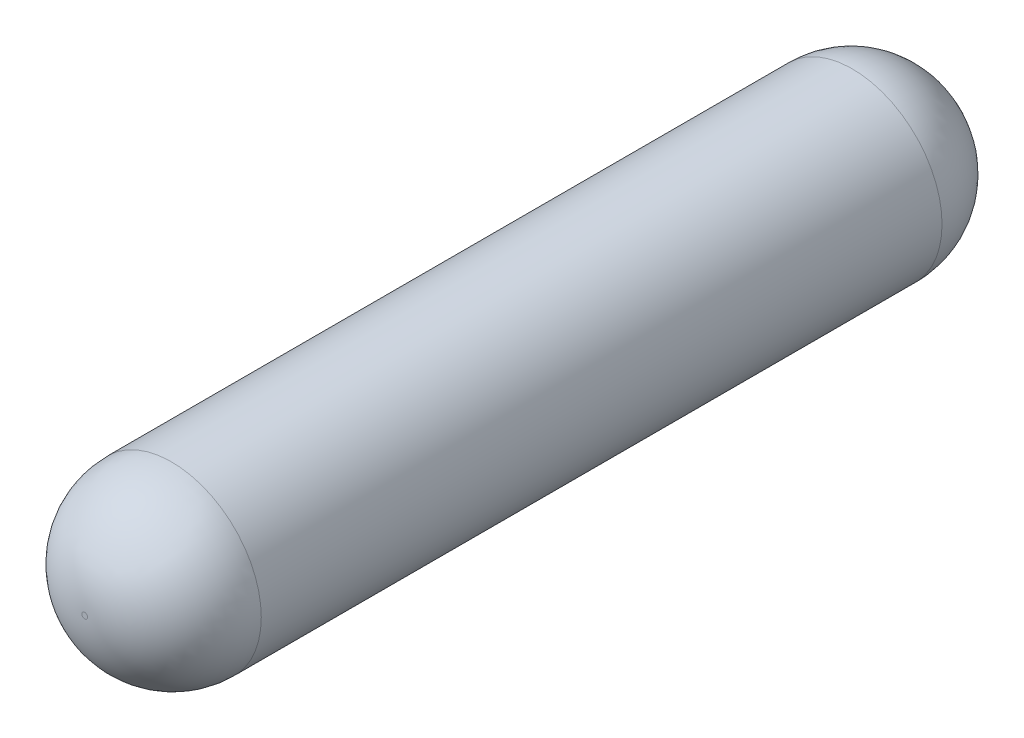
ISO-10303-21;
HEADER;
FILE_DESCRIPTION(('STEP AP214'),'2;1');
FILE_NAME('part.step','',(''),(''),'','','');
FILE_SCHEMA(('AUTOMOTIVE_DESIGN { 1 0 10303 214 1 1 1 1 }'));
ENDSEC;
DATA;
#1=APPLICATION_CONTEXT('core data for automotive mechanical design processes');
#2=APPLICATION_PROTOCOL_DEFINITION('international standard','automotive_design',2000,#1);
#3=PRODUCT_CONTEXT('',#1,'mechanical');
#4=PRODUCT('Part','Part','',(#3));
#5=PRODUCT_RELATED_PRODUCT_CATEGORY('part','',(#4));
#6=PRODUCT_DEFINITION_FORMATION('','',#4);
#7=PRODUCT_DEFINITION_CONTEXT('part definition',#1,'design');
#8=PRODUCT_DEFINITION('design','',#6,#7);
#9=PRODUCT_DEFINITION_SHAPE('','',#8);
#10=(LENGTH_UNIT() NAMED_UNIT(*) SI_UNIT(.MILLI.,.METRE.));
#11=(NAMED_UNIT(*) PLANE_ANGLE_UNIT() SI_UNIT($,.RADIAN.));
#12=(NAMED_UNIT(*) SI_UNIT($,.STERADIAN.) SOLID_ANGLE_UNIT());
#13=UNCERTAINTY_MEASURE_WITH_UNIT(LENGTH_MEASURE(1.E-05),#10,'distance_accuracy_value','');
#14=(GEOMETRIC_REPRESENTATION_CONTEXT(3) GLOBAL_UNCERTAINTY_ASSIGNED_CONTEXT((#13)) GLOBAL_UNIT_ASSIGNED_CONTEXT((#10,
#11,#12)) REPRESENTATION_CONTEXT('',''));
#15=CARTESIAN_POINT('',(0.,0.,0.));
#16=DIRECTION('',(0.,0.,1.));
#17=DIRECTION('',(1.,0.,0.));
#18=AXIS2_PLACEMENT_3D('',#15,#16,#17);
#19=CARTESIAN_POINT('',(0.,0.,60.));
#20=DIRECTION('',(0.,0.,-1.));
#21=DIRECTION('',(-1.,0.,0.));
#22=AXIS2_PLACEMENT_3D('',#19,#20,#21);
#23=CYLINDRICAL_SURFACE('',#22,6.3);
#24=CARTESIAN_POINT('',(0.,0.,6.1));
#25=DIRECTION('',(0.,0.,1.));
#26=DIRECTION('',(1.,0.,0.));
#27=AXIS2_PLACEMENT_3D('',#24,#25,#26);
#28=CIRCLE('',#27,6.3);
#29=CARTESIAN_POINT('',(6.3,0.,6.1));
#30=VERTEX_POINT('',#29);
#31=EDGE_CURVE('E50',#30,#30,#28,.T.);
#32=ORIENTED_EDGE('',*,*,#31,.T.);
#33=EDGE_LOOP('',(#32));
#34=FACE_BOUND('',#33,.T.);
#35=CARTESIAN_POINT('',(0.,0.,53.9));
#36=DIRECTION('',(0.,0.,1.));
#37=DIRECTION('',(1.,0.,0.));
#38=AXIS2_PLACEMENT_3D('',#35,#36,#37);
#39=CIRCLE('',#38,6.3);
#40=CARTESIAN_POINT('',(6.3,0.,53.9));
#41=VERTEX_POINT('',#40);
#42=EDGE_CURVE('E51',#41,#41,#39,.F.);
#43=ORIENTED_EDGE('',*,*,#42,.T.);
#44=EDGE_LOOP('',(#43));
#45=FACE_BOUND('',#44,.T.);
#46=ADVANCED_FACE('F38',(#34,#45),#23,.T.);
#47=CARTESIAN_POINT('',(0.,0.,60.));
#48=DIRECTION('',(0.,0.,1.));
#49=DIRECTION('',(1.,0.,0.));
#50=AXIS2_PLACEMENT_3D('',#47,#48,#49);
#51=PLANE('',#50);
#52=CARTESIAN_POINT('',(0.,0.,60.));
#53=DIRECTION('',(0.,0.,1.));
#54=DIRECTION('',(1.,0.,0.));
#55=AXIS2_PLACEMENT_3D('',#52,#53,#54);
#56=CIRCLE('',#55,0.200000000000001);
#57=CARTESIAN_POINT('',(0.200000000000001,0.,60.));
#58=VERTEX_POINT('',#57);
#59=EDGE_CURVE('E10',#58,#58,#56,.T.);
#60=ORIENTED_EDGE('',*,*,#59,.T.);
#61=EDGE_LOOP('',(#60));
#62=FACE_BOUND('',#61,.T.);
#63=ADVANCED_FACE('F70',(#62),#51,.T.);
#64=CARTESIAN_POINT('',(0.,0.,0.));
#65=DIRECTION('',(0.,0.,1.));
#66=DIRECTION('',(1.,0.,0.));
#67=AXIS2_PLACEMENT_3D('',#64,#65,#66);
#68=PLANE('',#67);
#69=CARTESIAN_POINT('',(0.,0.,0.));
#70=DIRECTION('',(0.,0.,1.));
#71=DIRECTION('',(1.,0.,0.));
#72=AXIS2_PLACEMENT_3D('',#69,#70,#71);
#73=CIRCLE('',#72,0.200000000000001);
#74=CARTESIAN_POINT('',(0.200000000000001,0.,0.));
#75=VERTEX_POINT('',#74);
#76=EDGE_CURVE('E43',#75,#75,#73,.F.);
#77=ORIENTED_EDGE('',*,*,#76,.T.);
#78=EDGE_LOOP('',(#77));
#79=FACE_BOUND('',#78,.T.);
#80=ADVANCED_FACE('F61',(#79),#68,.F.);
#81=CARTESIAN_POINT('',(0.,0.,6.1));
#82=DIRECTION('',(0.,0.,1.));
#83=DIRECTION('',(1.,0.,0.));
#84=AXIS2_PLACEMENT_3D('',#81,#82,#83);
#85=DEGENERATE_TOROIDAL_SURFACE('',#84,0.200000000000001,6.1,.T.);
#86=ORIENTED_EDGE('',*,*,#76,.F.);
#87=EDGE_LOOP('',(#86));
#88=FACE_BOUND('',#87,.T.);
#89=ORIENTED_EDGE('',*,*,#31,.F.);
#90=EDGE_LOOP('',(#89));
#91=FACE_BOUND('',#90,.T.);
#92=ADVANCED_FACE('F58',(#88,#91),#85,.T.);
#93=CARTESIAN_POINT('',(0.,0.,53.9));
#94=DIRECTION('',(0.,0.,1.));
#95=DIRECTION('',(1.,0.,0.));
#96=AXIS2_PLACEMENT_3D('',#93,#94,#95);
#97=DEGENERATE_TOROIDAL_SURFACE('',#96,0.200000000000001,6.1,.T.);
#98=ORIENTED_EDGE('',*,*,#42,.F.);
#99=EDGE_LOOP('',(#98));
#100=FACE_BOUND('',#99,.T.);
#101=ORIENTED_EDGE('',*,*,#59,.F.);
#102=EDGE_LOOP('',(#101));
#103=FACE_BOUND('',#102,.T.);
#104=ADVANCED_FACE('F36',(#100,#103),#97,.T.);
#105=CLOSED_SHELL('',(#46,#63,#80,#92,#104));
#106=MANIFOLD_SOLID_BREP('B2',#105);
#107=ADVANCED_BREP_SHAPE_REPRESENTATION('',(#18,#106),#14);
#108=SHAPE_DEFINITION_REPRESENTATION(#9,#107);
ENDSEC;
END-ISO-10303-21;
